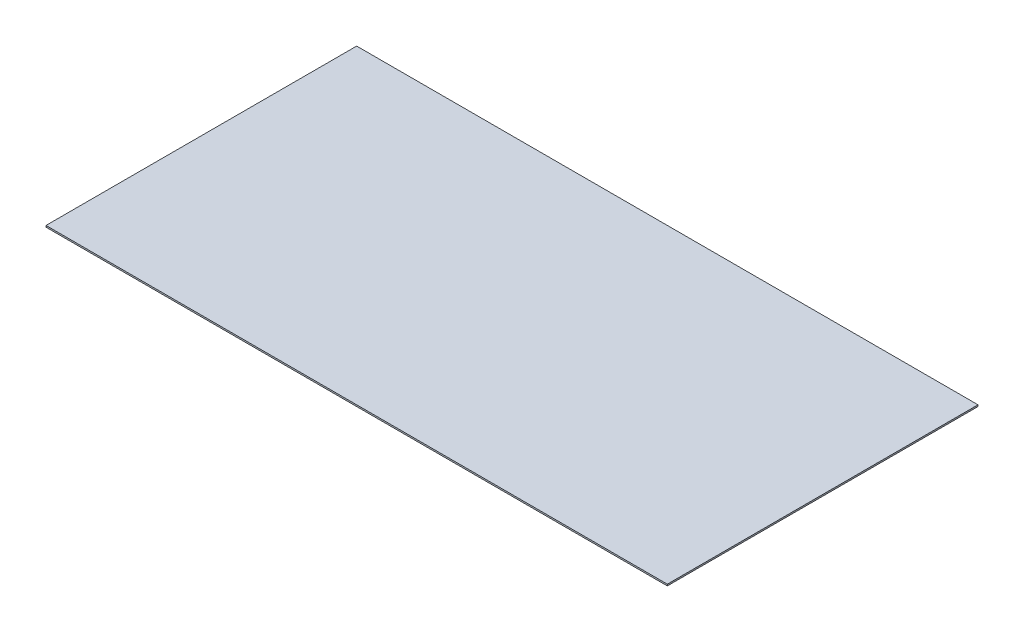
ISO-10303-21;
HEADER;
FILE_DESCRIPTION(('STEP AP214'),'2;1');
FILE_NAME('part.step','',(''),(''),'','','');
FILE_SCHEMA(('AUTOMOTIVE_DESIGN { 1 0 10303 214 1 1 1 1 }'));
ENDSEC;
DATA;
#1=APPLICATION_CONTEXT('core data for automotive mechanical design processes');
#2=APPLICATION_PROTOCOL_DEFINITION('international standard','automotive_design',2000,#1);
#3=PRODUCT_CONTEXT('',#1,'mechanical');
#4=PRODUCT('Part','Part','',(#3));
#5=PRODUCT_RELATED_PRODUCT_CATEGORY('part','',(#4));
#6=PRODUCT_DEFINITION_FORMATION('','',#4);
#7=PRODUCT_DEFINITION_CONTEXT('part definition',#1,'design');
#8=PRODUCT_DEFINITION('design','',#6,#7);
#9=PRODUCT_DEFINITION_SHAPE('','',#8);
#10=(LENGTH_UNIT() NAMED_UNIT(*) SI_UNIT(.MILLI.,.METRE.));
#11=(NAMED_UNIT(*) PLANE_ANGLE_UNIT() SI_UNIT($,.RADIAN.));
#12=(NAMED_UNIT(*) SI_UNIT($,.STERADIAN.) SOLID_ANGLE_UNIT());
#13=UNCERTAINTY_MEASURE_WITH_UNIT(LENGTH_MEASURE(1.E-05),#10,'distance_accuracy_value','');
#14=(GEOMETRIC_REPRESENTATION_CONTEXT(3) GLOBAL_UNCERTAINTY_ASSIGNED_CONTEXT((#13)) GLOBAL_UNIT_ASSIGNED_CONTEXT((#10,
#11,#12)) REPRESENTATION_CONTEXT('',''));
#15=CARTESIAN_POINT('',(0.,0.,0.));
#16=DIRECTION('',(0.,0.,1.));
#17=DIRECTION('',(1.,0.,0.));
#18=AXIS2_PLACEMENT_3D('',#15,#16,#17);
#19=CARTESIAN_POINT('',(0.,2.601,3.51907068929161));
#20=DIRECTION('',(0.,0.,-1.));
#21=DIRECTION('',(-1.,0.,0.));
#22=AXIS2_PLACEMENT_3D('',#19,#20,#21);
#23=PLANE('',#22);
#24=DIRECTION('',(1.,0.,0.));
#25=VECTOR('',#24,1.);
#26=CARTESIAN_POINT('',(0.,2.6,3.51907068929161));
#27=LINE('',#26,#25);
#28=CARTESIAN_POINT('',(4.37318429210739,2.6,3.51907068929161));
#29=VERTEX_POINT('',#28);
#30=CARTESIAN_POINT('',(4.77318429210671,2.6,3.51907068929161));
#31=VERTEX_POINT('',#30);
#32=EDGE_CURVE('E11',#29,#31,#27,.T.);
#33=ORIENTED_EDGE('',*,*,#32,.T.);
#34=DIRECTION('',(0.,-1.,0.));
#35=VECTOR('',#34,1.);
#36=CARTESIAN_POINT('',(4.77318429210671,2.601,3.51907068929161));
#37=LINE('',#36,#35);
#38=CARTESIAN_POINT('',(4.77318429210671,2.601,3.51907068929161));
#39=VERTEX_POINT('',#38);
#40=EDGE_CURVE('E24',#39,#31,#37,.T.);
#41=ORIENTED_EDGE('',*,*,#40,.F.);
#42=DIRECTION('',(1.,0.,0.));
#43=VECTOR('',#42,1.);
#44=CARTESIAN_POINT('',(0.,2.601,3.51907068929161));
#45=LINE('',#44,#43);
#46=CARTESIAN_POINT('',(4.37318429210739,2.601,3.51907068929161));
#47=VERTEX_POINT('',#46);
#48=EDGE_CURVE('E88',#47,#39,#45,.T.);
#49=ORIENTED_EDGE('',*,*,#48,.F.);
#50=DIRECTION('',(0.,-1.,0.));
#51=VECTOR('',#50,1.);
#52=CARTESIAN_POINT('',(4.37318429210739,2.601,3.51907068929161));
#53=LINE('',#52,#51);
#54=EDGE_CURVE('E77',#47,#29,#53,.T.);
#55=ORIENTED_EDGE('',*,*,#54,.T.);
#56=EDGE_LOOP('',(#33,#41,#49,#55));
#57=FACE_BOUND('',#56,.T.);
#58=ADVANCED_FACE('F17',(#57),#23,.F.);
#59=CARTESIAN_POINT('',(4.77318429210671,2.601,0.));
#60=DIRECTION('',(1.,0.,0.));
#61=DIRECTION('',(0.,0.,-1.));
#62=AXIS2_PLACEMENT_3D('',#59,#60,#61);
#63=PLANE('',#62);
#64=DIRECTION('',(0.,0.,1.));
#65=VECTOR('',#64,1.);
#66=CARTESIAN_POINT('',(4.77318429210671,2.6,0.));
#67=LINE('',#66,#65);
#68=CARTESIAN_POINT('',(4.77318429210671,2.6,3.31907068929161));
#69=VERTEX_POINT('',#68);
#70=EDGE_CURVE('E85',#69,#31,#67,.T.);
#71=ORIENTED_EDGE('',*,*,#70,.F.);
#72=DIRECTION('',(0.,-1.,0.));
#73=VECTOR('',#72,1.);
#74=CARTESIAN_POINT('',(4.77318429210671,2.601,3.31907068929161));
#75=LINE('',#74,#73);
#76=CARTESIAN_POINT('',(4.77318429210671,2.601,3.31907068929161));
#77=VERTEX_POINT('',#76);
#78=EDGE_CURVE('E83',#77,#69,#75,.T.);
#79=ORIENTED_EDGE('',*,*,#78,.F.);
#80=DIRECTION('',(0.,0.,1.));
#81=VECTOR('',#80,1.);
#82=CARTESIAN_POINT('',(4.77318429210671,2.601,0.));
#83=LINE('',#82,#81);
#84=EDGE_CURVE('E72',#77,#39,#83,.T.);
#85=ORIENTED_EDGE('',*,*,#84,.T.);
#86=ORIENTED_EDGE('',*,*,#40,.T.);
#87=EDGE_LOOP('',(#71,#79,#85,#86));
#88=FACE_BOUND('',#87,.T.);
#89=ADVANCED_FACE('F90',(#88),#63,.T.);
#90=CARTESIAN_POINT('',(0.,2.601,3.31907068929161));
#91=DIRECTION('',(0.,0.,-1.));
#92=DIRECTION('',(-1.,0.,0.));
#93=AXIS2_PLACEMENT_3D('',#90,#91,#92);
#94=PLANE('',#93);
#95=DIRECTION('',(1.,0.,0.));
#96=VECTOR('',#95,1.);
#97=CARTESIAN_POINT('',(0.,2.6,3.31907068929161));
#98=LINE('',#97,#96);
#99=CARTESIAN_POINT('',(4.37318429210739,2.6,3.31907068929161));
#100=VERTEX_POINT('',#99);
#101=EDGE_CURVE('E60',#100,#69,#98,.T.);
#102=ORIENTED_EDGE('',*,*,#101,.F.);
#103=DIRECTION('',(0.,-1.,0.));
#104=VECTOR('',#103,1.);
#105=CARTESIAN_POINT('',(4.37318429210739,2.601,3.31907068929161));
#106=LINE('',#105,#104);
#107=CARTESIAN_POINT('',(4.37318429210739,2.601,3.31907068929161));
#108=VERTEX_POINT('',#107);
#109=EDGE_CURVE('E54',#108,#100,#106,.T.);
#110=ORIENTED_EDGE('',*,*,#109,.F.);
#111=DIRECTION('',(1.,0.,0.));
#112=VECTOR('',#111,1.);
#113=CARTESIAN_POINT('',(0.,2.601,3.31907068929161));
#114=LINE('',#113,#112);
#115=EDGE_CURVE('E58',#108,#77,#114,.T.);
#116=ORIENTED_EDGE('',*,*,#115,.T.);
#117=ORIENTED_EDGE('',*,*,#78,.T.);
#118=EDGE_LOOP('',(#102,#110,#116,#117));
#119=FACE_BOUND('',#118,.T.);
#120=ADVANCED_FACE('F56',(#119),#94,.T.);
#121=CARTESIAN_POINT('',(4.37318429210739,2.601,0.));
#122=DIRECTION('',(1.,0.,0.));
#123=DIRECTION('',(0.,0.,-1.));
#124=AXIS2_PLACEMENT_3D('',#121,#122,#123);
#125=PLANE('',#124);
#126=DIRECTION('',(0.,0.,1.));
#127=VECTOR('',#126,1.);
#128=CARTESIAN_POINT('',(4.37318429210739,2.6,0.));
#129=LINE('',#128,#127);
#130=EDGE_CURVE('E73',#100,#29,#129,.T.);
#131=ORIENTED_EDGE('',*,*,#130,.T.);
#132=ORIENTED_EDGE('',*,*,#54,.F.);
#133=DIRECTION('',(0.,0.,1.));
#134=VECTOR('',#133,1.);
#135=CARTESIAN_POINT('',(4.37318429210739,2.601,0.));
#136=LINE('',#135,#134);
#137=EDGE_CURVE('E70',#108,#47,#136,.T.);
#138=ORIENTED_EDGE('',*,*,#137,.F.);
#139=ORIENTED_EDGE('',*,*,#109,.T.);
#140=EDGE_LOOP('',(#131,#132,#138,#139));
#141=FACE_BOUND('',#140,.T.);
#142=ADVANCED_FACE('F76',(#141),#125,.F.);
#143=CARTESIAN_POINT('',(0.,2.601,0.));
#144=DIRECTION('',(0.,1.,0.));
#145=DIRECTION('',(0.,0.,1.));
#146=AXIS2_PLACEMENT_3D('',#143,#144,#145);
#147=PLANE('',#146);
#148=ORIENTED_EDGE('',*,*,#48,.T.);
#149=ORIENTED_EDGE('',*,*,#84,.F.);
#150=ORIENTED_EDGE('',*,*,#115,.F.);
#151=ORIENTED_EDGE('',*,*,#137,.T.);
#152=EDGE_LOOP('',(#148,#149,#150,#151));
#153=FACE_BOUND('',#152,.T.);
#154=ADVANCED_FACE('F69',(#153),#147,.T.);
#155=CARTESIAN_POINT('',(0.,2.6,0.));
#156=DIRECTION('',(0.,1.,0.));
#157=DIRECTION('',(0.,0.,1.));
#158=AXIS2_PLACEMENT_3D('',#155,#156,#157);
#159=PLANE('',#158);
#160=ORIENTED_EDGE('',*,*,#32,.F.);
#161=ORIENTED_EDGE('',*,*,#130,.F.);
#162=ORIENTED_EDGE('',*,*,#101,.T.);
#163=ORIENTED_EDGE('',*,*,#70,.T.);
#164=EDGE_LOOP('',(#160,#161,#162,#163));
#165=FACE_BOUND('',#164,.T.);
#166=ADVANCED_FACE('F91',(#165),#159,.F.);
#167=CLOSED_SHELL('',(#58,#89,#120,#142,#154,#166));
#168=MANIFOLD_SOLID_BREP('B1',#167);
#169=ADVANCED_BREP_SHAPE_REPRESENTATION('',(#18,#168),#14);
#170=SHAPE_DEFINITION_REPRESENTATION(#9,#169);
ENDSEC;
END-ISO-10303-21;
